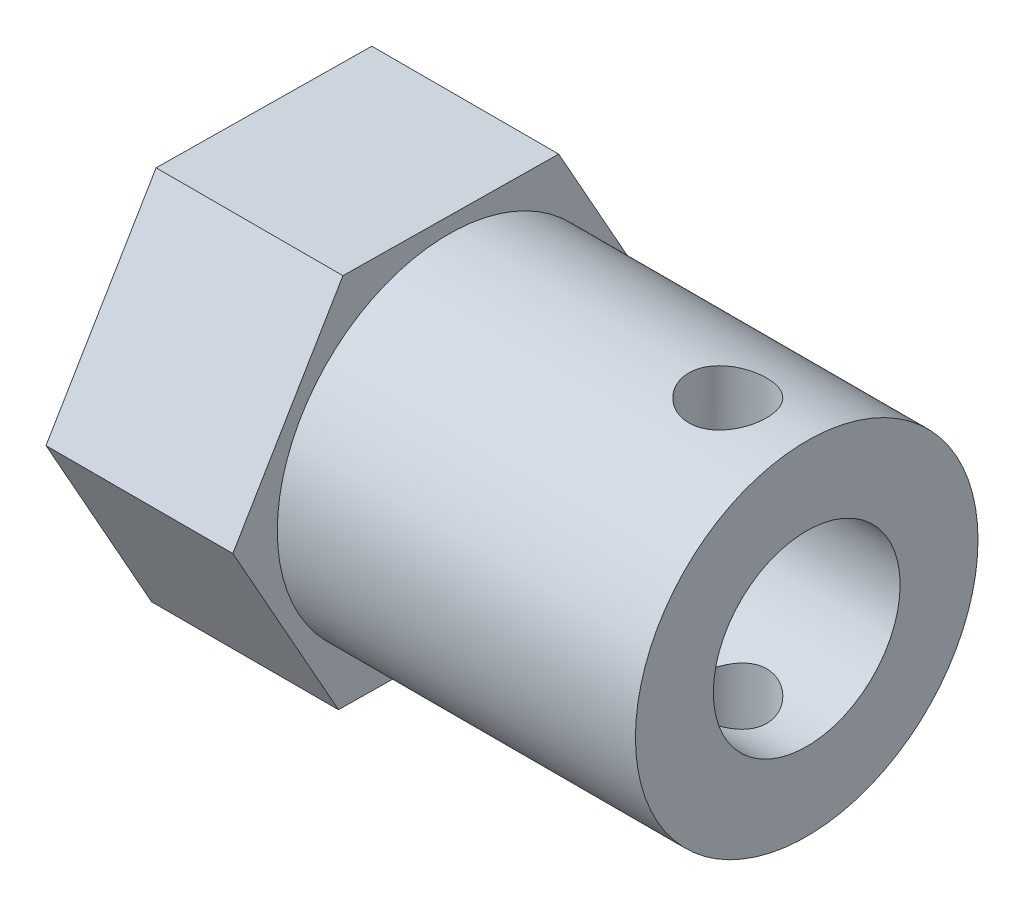
ISO-10303-21;
HEADER;
FILE_DESCRIPTION(('STEP AP214'),'2;1');
FILE_NAME('part.step','',(''),(''),'','','');
FILE_SCHEMA(('AUTOMOTIVE_DESIGN { 1 0 10303 214 1 1 1 1 }'));
ENDSEC;
DATA;
#1=APPLICATION_CONTEXT('core data for automotive mechanical design processes');
#2=APPLICATION_PROTOCOL_DEFINITION('international standard','automotive_design',2000,#1);
#3=PRODUCT_CONTEXT('',#1,'mechanical');
#4=PRODUCT('Part','Part','',(#3));
#5=PRODUCT_RELATED_PRODUCT_CATEGORY('part','',(#4));
#6=PRODUCT_DEFINITION_FORMATION('','',#4);
#7=PRODUCT_DEFINITION_CONTEXT('part definition',#1,'design');
#8=PRODUCT_DEFINITION('design','',#6,#7);
#9=PRODUCT_DEFINITION_SHAPE('','',#8);
#10=(LENGTH_UNIT() NAMED_UNIT(*) SI_UNIT(.MILLI.,.METRE.));
#11=(NAMED_UNIT(*) PLANE_ANGLE_UNIT() SI_UNIT($,.RADIAN.));
#12=(NAMED_UNIT(*) SI_UNIT($,.STERADIAN.) SOLID_ANGLE_UNIT());
#13=UNCERTAINTY_MEASURE_WITH_UNIT(LENGTH_MEASURE(1.E-05),#10,'distance_accuracy_value','');
#14=(GEOMETRIC_REPRESENTATION_CONTEXT(3) GLOBAL_UNCERTAINTY_ASSIGNED_CONTEXT((#13)) GLOBAL_UNIT_ASSIGNED_CONTEXT((#10,
#11,#12)) REPRESENTATION_CONTEXT('',''));
#15=CARTESIAN_POINT('',(0.,0.,0.));
#16=DIRECTION('',(0.,0.,1.));
#17=DIRECTION('',(1.,0.,0.));
#18=AXIS2_PLACEMENT_3D('',#15,#16,#17);
#19=CARTESIAN_POINT('',(11.5,0.,0.));
#20=DIRECTION('',(-1.,0.,0.));
#21=DIRECTION('',(0.,0.,1.));
#22=AXIS2_PLACEMENT_3D('',#19,#20,#21);
#23=CYLINDRICAL_SURFACE('',#22,5.5);
#24=CARTESIAN_POINT('',(8.96540278513979,-5.35607132140714,1.25));
#25=CARTESIAN_POINT('',(9.03463588061611,-5.35607271569806,1.24999771619423));
#26=CARTESIAN_POINT('',(9.10389582630813,-5.35742832363105,1.24422856166961));
#27=CARTESIAN_POINT('',(9.24044107266821,-5.36269332424885,1.22133260118391));
#28=CARTESIAN_POINT('',(9.3077249859071,-5.3666044684747,1.20419800533182));
#29=CARTESIAN_POINT('',(9.43832331432646,-5.3765152232523,1.15914270188604));
#30=CARTESIAN_POINT('',(9.50164218743225,-5.38251243679928,1.13123436986438));
#31=CARTESIAN_POINT('',(9.62270198498046,-5.39591668787014,1.0654598749522));
#32=CARTESIAN_POINT('',(9.68044293091887,-5.4033237199606,1.02759375043871));
#33=CARTESIAN_POINT('',(9.78976052557524,-5.41886390208649,0.942242640179427));
#34=CARTESIAN_POINT('',(9.84122067534506,-5.42700696073142,0.89461022010112));
#35=CARTESIAN_POINT('',(9.93549403769439,-5.44301514430799,0.79139673028718));
#36=CARTESIAN_POINT('',(9.97830654433696,-5.45088024650588,0.735815012255048));
#37=CARTESIAN_POINT('',(10.0545343092758,-5.465554705025,0.617495106422174));
#38=CARTESIAN_POINT('',(10.0878368853551,-5.47235100492417,0.554682564129416));
#39=CARTESIAN_POINT('',(10.1433694943463,-5.48400988207614,0.424171927818221));
#40=CARTESIAN_POINT('',(10.165600870705,-5.48887269393571,0.356474427712261));
#41=CARTESIAN_POINT('',(10.1979918330142,-5.49604666041601,0.219327796948699));
#42=CARTESIAN_POINT('',(10.2083487738185,-5.49839948403379,0.149927493751898));
#43=CARTESIAN_POINT('',(10.2173145516804,-5.50043296396436,0.0103372295205211));
#44=CARTESIAN_POINT('',(10.2159248352728,-5.50011394929908,-0.0598526332211525));
#45=CARTESIAN_POINT('',(10.2015824208531,-5.49687132737987,-0.197666935456022));
#46=CARTESIAN_POINT('',(10.1888425211329,-5.4939956555269,-0.265314815812265));
#47=CARTESIAN_POINT('',(10.1525012453141,-5.48601775047252,-0.397486515579181));
#48=CARTESIAN_POINT('',(10.1288993532431,-5.48091541149934,-0.462010186421015));
#49=CARTESIAN_POINT('',(10.0713200802062,-5.4689813591498,-0.586684721878421));
#50=CARTESIAN_POINT('',(10.0372633347719,-5.46213648824824,-0.646797621996536));
#51=CARTESIAN_POINT('',(9.95980052916184,-5.44746585730485,-0.76053199978308));
#52=CARTESIAN_POINT('',(9.9163931013488,-5.43963995384659,-0.814152526078443));
#53=CARTESIAN_POINT('',(9.82030707730814,-5.42365855332192,-0.914646772136773));
#54=CARTESIAN_POINT('',(9.76744227973959,-5.41549960097905,-0.961342074892392));
#55=CARTESIAN_POINT('',(9.65454737727108,-5.39993520224881,-1.04523960036566));
#56=CARTESIAN_POINT('',(9.59451704558225,-5.39252977972439,-1.08244152250121));
#57=CARTESIAN_POINT('',(9.46869079108492,-5.37930083956819,-1.14638443688917));
#58=CARTESIAN_POINT('',(9.4028759081799,-5.37348280157186,-1.17308932984505));
#59=CARTESIAN_POINT('',(9.26752850827014,-5.36416156133669,-1.21500479464696));
#60=CARTESIAN_POINT('',(9.19799663559214,-5.36065795929618,-1.23021735177408));
#61=CARTESIAN_POINT('',(9.05882566130886,-5.35644447103176,-1.24843460096688));
#62=CARTESIAN_POINT('',(8.98922246873293,-5.35567490508626,-1.25170012601047));
#63=CARTESIAN_POINT('',(8.85046618106715,-5.35685524946336,-1.24663886357908));
#64=CARTESIAN_POINT('',(8.781313052766,-5.35880495678504,-1.23831294143621));
#65=CARTESIAN_POINT('',(8.6463436382356,-5.36514758668855,-1.21053208830858));
#66=CARTESIAN_POINT('',(8.58049570173688,-5.36950848562745,-1.19122293373319));
#67=CARTESIAN_POINT('',(8.45296998892442,-5.38015285157009,-1.14218254768222));
#68=CARTESIAN_POINT('',(8.39129263830518,-5.38643651447105,-1.11245025421961));
#69=CARTESIAN_POINT('',(8.27273626562012,-5.40034808671371,-1.04284048047499));
#70=CARTESIAN_POINT('',(8.21595331561935,-5.4079964833553,-1.00280355444638));
#71=CARTESIAN_POINT('',(8.10981613351678,-5.42372272229399,-0.913927790878069));
#72=CARTESIAN_POINT('',(8.06046290288045,-5.43180062228642,-0.865087768698988));
#73=CARTESIAN_POINT('',(7.96956223613188,-5.44767387128745,-0.758807449059142));
#74=CARTESIAN_POINT('',(7.9281933227794,-5.45546017266619,-0.70121287661363));
#75=CARTESIAN_POINT('',(7.85571737798727,-5.46970150039047,-0.579740838143496));
#76=CARTESIAN_POINT('',(7.82460984835701,-5.47615659136063,-0.515863677334327));
#77=CARTESIAN_POINT('',(7.77378257959981,-5.48697029299492,-0.384052524657954));
#78=CARTESIAN_POINT('',(7.75398762144034,-5.49134271843123,-0.316148723135448));
#79=CARTESIAN_POINT('',(7.72611451146264,-5.49755837946589,-0.177868141541238));
#80=CARTESIAN_POINT('',(7.71803451280763,-5.49940201371996,-0.107491753059365));
#81=CARTESIAN_POINT('',(7.71390922705384,-5.50033936514418,0.032046321364278));
#82=CARTESIAN_POINT('',(7.71759824588683,-5.49949379441287,0.101199876219376));
#83=CARTESIAN_POINT('',(7.73630825947884,-5.495279008056,0.237873894864679));
#84=CARTESIAN_POINT('',(7.75132901812873,-5.49190984501223,0.305394392651152));
#85=CARTESIAN_POINT('',(7.79214460474552,-5.48303224132098,0.436661017109417));
#86=CARTESIAN_POINT('',(7.81789900769078,-5.47753183277209,0.500420291420025));
#87=CARTESIAN_POINT('',(7.8794123985696,-5.46497684589025,0.622746579339581));
#88=CARTESIAN_POINT('',(7.91517243898255,-5.4579221040757,0.68131304587022));
#89=CARTESIAN_POINT('',(7.99653376746235,-5.44284675668577,0.792878151421588));
#90=CARTESIAN_POINT('',(8.04232024234268,-5.43480943945445,0.845739490733954));
#91=CARTESIAN_POINT('',(8.14206477028438,-5.41876069975522,0.943119149893003));
#92=CARTESIAN_POINT('',(8.19602481241624,-5.41074928407657,0.987635433020155));
#93=CARTESIAN_POINT('',(8.31153878206244,-5.39552746381206,1.06769503602717));
#94=CARTESIAN_POINT('',(8.37319264162432,-5.38833055874737,1.10309689858482));
#95=CARTESIAN_POINT('',(8.5017272108256,-5.37572512012673,1.16298018793326));
#96=CARTESIAN_POINT('',(8.56860360214515,-5.3703151279975,1.18747052701551));
#97=CARTESIAN_POINT('',(8.69048676386535,-5.36285672020335,1.22064955230649));
#98=CARTESIAN_POINT('',(8.7448508714241,-5.36032965084645,1.23163414148622));
#99=CARTESIAN_POINT('',(8.85460522104708,-5.35693644077948,1.24631007168687));
#100=CARTESIAN_POINT('',(8.90999540453747,-5.35607020555341,1.25000182773419));
#101=CARTESIAN_POINT('',(8.96540278513979,-5.35607132140714,1.25));
#102=B_SPLINE_CURVE_WITH_KNOTS('',3,(#24,#25,#26,#27,#28,#29,#30,#31,#32,#33,#34,#35,#36,#37,
#38,#39,#40,#41,#42,#43,#44,#45,#46,#47,#48,#49,#50,#51,#52,#53,#54,#55,#56,#57,#58,#59,#60,#61,
#62,#63,#64,#65,#66,#67,#68,#69,#70,#71,#72,#73,#74,#75,#76,#77,#78,#79,#80,#81,#82,#83,#84,#85,
#86,#87,#88,#89,#90,#91,#92,#93,#94,#95,#96,#97,#98,#99,#100,#101),.UNSPECIFIED.,.T.,.F.,(4,2,2,
2,2,2,2,2,2,2,2,2,2,2,2,2,2,2,2,2,2,2,2,2,2,2,2,2,2,2,2,2,2,2,2,2,2,2,4),(0.,0.207496121650815,
0.41513460862239,0.622535291788398,0.829935175650532,1.04073318636022,1.2515483982898,
1.46476669375054,1.67795910969756,1.88755439091892,2.0971238620348,2.3028450333366,
2.50857597792603,2.71590898418404,2.92327233572579,3.13528932547437,3.34731302733212,
3.5600596298443,3.77276947234059,3.98080665115182,4.18882830027155,4.39415131138951,
4.59949524842834,4.8082306047921,5.01699407183283,5.2299896299062,5.44297484551386,
5.65452690065785,5.86604560147264,6.07282318924715,6.27959646870456,6.48559793754366,
6.6916210835488,6.90183008119015,7.1120903164666,7.32544005280889,7.53861520890221,
7.70468420860328,7.87074375724421),.UNSPECIFIED.);
#103=CARTESIAN_POINT('',(8.96540278513979,-5.35607132140714,1.25));
#104=VERTEX_POINT('',#103);
#105=EDGE_CURVE('E176',#104,#104,#102,.T.);
#106=ORIENTED_EDGE('',*,*,#105,.T.);
#107=EDGE_LOOP('',(#106));
#108=FACE_BOUND('',#107,.T.);
#109=CARTESIAN_POINT('',(8.96540278513979,5.35607132140714,1.25));
#110=CARTESIAN_POINT('',(8.89616968966347,5.35607271569806,1.24999771619423));
#111=CARTESIAN_POINT('',(8.82690974397145,5.35742832363105,1.24422856166961));
#112=CARTESIAN_POINT('',(8.69036449761137,5.36269332424885,1.22133260118391));
#113=CARTESIAN_POINT('',(8.62308058437248,5.3666044684747,1.20419800533182));
#114=CARTESIAN_POINT('',(8.49248225595313,5.3765152232523,1.15914270188604));
#115=CARTESIAN_POINT('',(8.42916338284733,5.38251243679928,1.13123436986438));
#116=CARTESIAN_POINT('',(8.30810358529912,5.39591668787014,1.0654598749522));
#117=CARTESIAN_POINT('',(8.25036263936071,5.4033237199606,1.02759375043871));
#118=CARTESIAN_POINT('',(8.14104504470434,5.41886390208649,0.942242640179427));
#119=CARTESIAN_POINT('',(8.08958489493452,5.42700696073142,0.894610220101119));
#120=CARTESIAN_POINT('',(7.99531153258519,5.44301514430799,0.791396730287179));
#121=CARTESIAN_POINT('',(7.95249902594262,5.45088024650588,0.735815012255048));
#122=CARTESIAN_POINT('',(7.87627126100376,5.465554705025,0.617495106422174));
#123=CARTESIAN_POINT('',(7.84296868492445,5.47235100492417,0.554682564129416));
#124=CARTESIAN_POINT('',(7.78743607593325,5.48400988207614,0.424171927818221));
#125=CARTESIAN_POINT('',(7.76520469957461,5.48887269393571,0.356474427712261));
#126=CARTESIAN_POINT('',(7.73281373726539,5.49604666041601,0.219327796948699));
#127=CARTESIAN_POINT('',(7.72245679646105,5.49839948403379,0.149927493751898));
#128=CARTESIAN_POINT('',(7.71349101859919,5.50043296396436,0.0103372295205208));
#129=CARTESIAN_POINT('',(7.71488073500683,5.50011394929908,-0.0598526332211529));
#130=CARTESIAN_POINT('',(7.72922314942653,5.49687132737987,-0.197666935456022));
#131=CARTESIAN_POINT('',(7.74196304914667,5.4939956555269,-0.265314815812265));
#132=CARTESIAN_POINT('',(7.77830432496551,5.48601775047252,-0.397486515579181));
#133=CARTESIAN_POINT('',(7.80190621703647,5.48091541149934,-0.462010186421015));
#134=CARTESIAN_POINT('',(7.85948549007335,5.4689813591498,-0.586684721878421));
#135=CARTESIAN_POINT('',(7.89354223550768,5.46213648824824,-0.646797621996536));
#136=CARTESIAN_POINT('',(7.97100504111774,5.44746585730485,-0.76053199978308));
#137=CARTESIAN_POINT('',(8.01441246893078,5.43963995384659,-0.814152526078443));
#138=CARTESIAN_POINT('',(8.11049849297144,5.42365855332192,-0.914646772136773));
#139=CARTESIAN_POINT('',(8.16336329053999,5.41549960097905,-0.961342074892392));
#140=CARTESIAN_POINT('',(8.2762581930085,5.39993520224881,-1.04523960036566));
#141=CARTESIAN_POINT('',(8.33628852469733,5.39252977972439,-1.08244152250121));
#142=CARTESIAN_POINT('',(8.46211477919466,5.37930083956819,-1.14638443688917));
#143=CARTESIAN_POINT('',(8.52792966209968,5.37348280157186,-1.17308932984505));
#144=CARTESIAN_POINT('',(8.66327706200945,5.36416156133669,-1.21500479464696));
#145=CARTESIAN_POINT('',(8.73280893468744,5.36065795929618,-1.23021735177408));
#146=CARTESIAN_POINT('',(8.87197990897072,5.35644447103176,-1.24843460096688));
#147=CARTESIAN_POINT('',(8.94158310154665,5.35567490508626,-1.25170012601047));
#148=CARTESIAN_POINT('',(9.08033938921243,5.35685524946336,-1.24663886357908));
#149=CARTESIAN_POINT('',(9.14949251751359,5.35880495678504,-1.23831294143621));
#150=CARTESIAN_POINT('',(9.28446193204398,5.36514758668855,-1.21053208830858));
#151=CARTESIAN_POINT('',(9.3503098685427,5.36950848562745,-1.19122293373319));
#152=CARTESIAN_POINT('',(9.47783558135516,5.38015285157009,-1.14218254768222));
#153=CARTESIAN_POINT('',(9.5395129319744,5.38643651447105,-1.11245025421961));
#154=CARTESIAN_POINT('',(9.65806930465946,5.40034808671371,-1.04284048047499));
#155=CARTESIAN_POINT('',(9.71485225466023,5.4079964833553,-1.00280355444638));
#156=CARTESIAN_POINT('',(9.8209894367628,5.42372272229399,-0.913927790878069));
#157=CARTESIAN_POINT('',(9.87034266739913,5.43180062228642,-0.865087768698988));
#158=CARTESIAN_POINT('',(9.9612433341477,5.44767387128745,-0.758807449059142));
#159=CARTESIAN_POINT('',(10.0026122475002,5.45546017266619,-0.701212876613629));
#160=CARTESIAN_POINT('',(10.0750881922923,5.46970150039047,-0.579740838143496));
#161=CARTESIAN_POINT('',(10.1061957219226,5.47615659136063,-0.515863677334327));
#162=CARTESIAN_POINT('',(10.1570229906798,5.48697029299492,-0.384052524657955));
#163=CARTESIAN_POINT('',(10.1768179488392,5.49134271843123,-0.316148723135449));
#164=CARTESIAN_POINT('',(10.2046910588169,5.49755837946589,-0.177868141541239));
#165=CARTESIAN_POINT('',(10.2127710574719,5.49940201371996,-0.107491753059365));
#166=CARTESIAN_POINT('',(10.2168963432257,5.50033936514418,0.0320463213642781));
#167=CARTESIAN_POINT('',(10.2132073243928,5.49949379441287,0.101199876219376));
#168=CARTESIAN_POINT('',(10.1944973108007,5.495279008056,0.237873894864679));
#169=CARTESIAN_POINT('',(10.1794765521508,5.49190984501223,0.305394392651152));
#170=CARTESIAN_POINT('',(10.1386609655341,5.48303224132098,0.436661017109417));
#171=CARTESIAN_POINT('',(10.1129065625888,5.47753183277209,0.500420291420025));
#172=CARTESIAN_POINT('',(10.05139317171,5.46497684589025,0.622746579339581));
#173=CARTESIAN_POINT('',(10.015633131297,5.4579221040757,0.68131304587022));
#174=CARTESIAN_POINT('',(9.93427180281723,5.44284675668577,0.792878151421588));
#175=CARTESIAN_POINT('',(9.8884853279369,5.43480943945445,0.845739490733953));
#176=CARTESIAN_POINT('',(9.7887407999952,5.41876069975522,0.943119149893002));
#177=CARTESIAN_POINT('',(9.73478075786334,5.41074928407657,0.987635433020155));
#178=CARTESIAN_POINT('',(9.61926678821714,5.39552746381206,1.06769503602717));
#179=CARTESIAN_POINT('',(9.55761292865526,5.38833055874737,1.10309689858482));
#180=CARTESIAN_POINT('',(9.42907835945398,5.37572512012673,1.16298018793326));
#181=CARTESIAN_POINT('',(9.36220196813443,5.3703151279975,1.18747052701551));
#182=CARTESIAN_POINT('',(9.24031880641423,5.36285672020335,1.22064955230649));
#183=CARTESIAN_POINT('',(9.18595469885549,5.36032965084645,1.23163414148622));
#184=CARTESIAN_POINT('',(9.07620034923251,5.35693644077948,1.24631007168687));
#185=CARTESIAN_POINT('',(9.02081016574211,5.35607020555341,1.25000182773419));
#186=CARTESIAN_POINT('',(8.96540278513979,5.35607132140714,1.25));
#187=B_SPLINE_CURVE_WITH_KNOTS('',3,(#109,#110,#111,#112,#113,#114,#115,#116,#117,#118,#119,
#120,#121,#122,#123,#124,#125,#126,#127,#128,#129,#130,#131,#132,#133,#134,#135,#136,#137,#138,
#139,#140,#141,#142,#143,#144,#145,#146,#147,#148,#149,#150,#151,#152,#153,#154,#155,#156,#157,
#158,#159,#160,#161,#162,#163,#164,#165,#166,#167,#168,#169,#170,#171,#172,#173,#174,#175,#176,
#177,#178,#179,#180,#181,#182,#183,#184,#185,#186),.UNSPECIFIED.,.T.,.F.,(4,2,2,2,2,2,2,2,2,2,2,
2,2,2,2,2,2,2,2,2,2,2,2,2,2,2,2,2,2,2,2,2,2,2,2,2,2,2,4),(0.,0.207496121650815,0.41513460862239,
0.6225352917884,0.829935175650532,1.04073318636022,1.2515483982898,1.46476669375054,
1.67795910969756,1.88755439091892,2.0971238620348,2.3028450333366,2.50857597792603,
2.71590898418404,2.92327233572579,3.13528932547437,3.34731302733212,3.5600596298443,
3.77276947234059,3.98080665115182,4.18882830027155,4.39415131138951,4.59949524842834,
4.8082306047921,5.01699407183283,5.2299896299062,5.44297484551386,5.65452690065785,
5.86604560147264,6.07282318924714,6.27959646870456,6.48559793754366,6.6916210835488,
6.90183008119014,7.11209031646659,7.32544005280888,7.5386152089022,7.70468420860328,
7.87074375724421),.UNSPECIFIED.);
#188=CARTESIAN_POINT('',(8.96540278513979,5.35607132140714,1.25));
#189=VERTEX_POINT('',#188);
#190=EDGE_CURVE('E170',#189,#189,#187,.T.);
#191=ORIENTED_EDGE('',*,*,#190,.T.);
#192=EDGE_LOOP('',(#191));
#193=FACE_BOUND('',#192,.T.);
#194=CARTESIAN_POINT('',(11.5,0.,0.));
#195=DIRECTION('',(1.,0.,0.));
#196=DIRECTION('',(0.,0.,-1.));
#197=AXIS2_PLACEMENT_3D('',#194,#195,#196);
#198=CIRCLE('',#197,5.5);
#199=CARTESIAN_POINT('',(11.5,0.,-5.5));
#200=VERTEX_POINT('',#199);
#201=EDGE_CURVE('E11',#200,#200,#198,.T.);
#202=ORIENTED_EDGE('',*,*,#201,.F.);
#203=EDGE_LOOP('',(#202));
#204=FACE_BOUND('',#203,.T.);
#205=CARTESIAN_POINT('',(0.,0.,0.));
#206=DIRECTION('',(1.,0.,0.));
#207=DIRECTION('',(0.,0.,-1.));
#208=AXIS2_PLACEMENT_3D('',#205,#206,#207);
#209=CIRCLE('',#208,5.5);
#210=CARTESIAN_POINT('',(0.,0.,-5.5));
#211=VERTEX_POINT('',#210);
#212=EDGE_CURVE('E47',#211,#211,#209,.T.);
#213=ORIENTED_EDGE('',*,*,#212,.T.);
#214=EDGE_LOOP('',(#213));
#215=FACE_BOUND('',#214,.T.);
#216=ADVANCED_FACE('F32',(#108,#193,#204,#215),#23,.T.);
#217=CARTESIAN_POINT('',(11.5,0.,0.));
#218=DIRECTION('',(1.,0.,0.));
#219=DIRECTION('',(0.,0.,-1.));
#220=AXIS2_PLACEMENT_3D('',#217,#218,#219);
#221=PLANE('',#220);
#222=CARTESIAN_POINT('',(11.5,0.,0.));
#223=DIRECTION('',(1.,0.,0.));
#224=DIRECTION('',(0.,0.,-1.));
#225=AXIS2_PLACEMENT_3D('',#222,#223,#224);
#226=CIRCLE('',#225,3.);
#227=CARTESIAN_POINT('',(11.5,0.,-3.));
#228=VERTEX_POINT('',#227);
#229=EDGE_CURVE('E184',#228,#228,#226,.T.);
#230=ORIENTED_EDGE('',*,*,#229,.F.);
#231=EDGE_LOOP('',(#230));
#232=FACE_BOUND('',#231,.T.);
#233=ORIENTED_EDGE('',*,*,#201,.T.);
#234=EDGE_LOOP('',(#233));
#235=FACE_BOUND('',#234,.T.);
#236=ADVANCED_FACE('F212',(#232,#235),#221,.T.);
#237=CARTESIAN_POINT('',(-6.,0.0826139418940273,6.9277106562417));
#238=DIRECTION('',(0.,-0.510291194267876,-0.860001684331295));
#239=DIRECTION('',(0.,0.860001684331295,-0.510291194267876));
#240=AXIS2_PLACEMENT_3D('',#237,#238,#239);
#241=PLANE('',#240);
#242=DIRECTION('',(0.,0.860001684331295,-0.510291194267876));
#243=VECTOR('',#242,1.);
#244=CARTESIAN_POINT('',(0.,0.0826139418940273,6.9277106562417));
#245=LINE('',#244,#243);
#246=CARTESIAN_POINT('',(0.,0.0826139418940273,6.9277106562417));
#247=VERTEX_POINT('',#246);
#248=CARTESIAN_POINT('',(0.,6.04088038932049,3.39230955573385));
#249=VERTEX_POINT('',#248);
#250=EDGE_CURVE('E125',#247,#249,#245,.T.);
#251=ORIENTED_EDGE('',*,*,#250,.T.);
#252=DIRECTION('',(1.,0.,0.));
#253=VECTOR('',#252,1.);
#254=CARTESIAN_POINT('',(-6.,6.04088038932049,3.39230955573385));
#255=LINE('',#254,#253);
#256=CARTESIAN_POINT('',(-6.,6.04088038932049,3.39230955573385));
#257=VERTEX_POINT('',#256);
#258=EDGE_CURVE('E143',#257,#249,#255,.T.);
#259=ORIENTED_EDGE('',*,*,#258,.F.);
#260=DIRECTION('',(0.,0.860001684331295,-0.510291194267876));
#261=VECTOR('',#260,1.);
#262=CARTESIAN_POINT('',(-6.,0.0826139418940273,6.9277106562417));
#263=LINE('',#262,#261);
#264=CARTESIAN_POINT('',(-6.,0.0826139418940273,6.9277106562417));
#265=VERTEX_POINT('',#264);
#266=EDGE_CURVE('E136',#265,#257,#263,.T.);
#267=ORIENTED_EDGE('',*,*,#266,.F.);
#268=DIRECTION('',(1.,0.,0.));
#269=VECTOR('',#268,1.);
#270=CARTESIAN_POINT('',(-6.,0.0826139418940273,6.9277106562417));
#271=LINE('',#270,#269);
#272=EDGE_CURVE('E121',#265,#247,#271,.T.);
#273=ORIENTED_EDGE('',*,*,#272,.T.);
#274=EDGE_LOOP('',(#251,#259,#267,#273));
#275=FACE_BOUND('',#274,.T.);
#276=ADVANCED_FACE('F200',(#275),#241,.F.);
#277=CARTESIAN_POINT('',(-6.,6.04088038932049,3.39230955573385));
#278=DIRECTION('',(0.,-0.999928903062245,0.0119242953978331));
#279=DIRECTION('',(0.,-0.0119242953978331,-0.999928903062245));
#280=AXIS2_PLACEMENT_3D('',#277,#278,#279);
#281=PLANE('',#280);
#282=DIRECTION('',(0.,-0.0119242953978331,-0.999928903062245));
#283=VECTOR('',#282,1.);
#284=CARTESIAN_POINT('',(0.,6.04088038932049,3.39230955573385));
#285=LINE('',#284,#283);
#286=CARTESIAN_POINT('',(0.,5.95826644742646,-3.53540110050785));
#287=VERTEX_POINT('',#286);
#288=EDGE_CURVE('E128',#249,#287,#285,.T.);
#289=ORIENTED_EDGE('',*,*,#288,.T.);
#290=DIRECTION('',(1.,0.,0.));
#291=VECTOR('',#290,1.);
#292=CARTESIAN_POINT('',(-6.,5.95826644742646,-3.53540110050785));
#293=LINE('',#292,#291);
#294=CARTESIAN_POINT('',(-6.,5.95826644742646,-3.53540110050785));
#295=VERTEX_POINT('',#294);
#296=EDGE_CURVE('E140',#295,#287,#293,.T.);
#297=ORIENTED_EDGE('',*,*,#296,.F.);
#298=DIRECTION('',(0.,-0.0119242953978331,-0.999928903062245));
#299=VECTOR('',#298,1.);
#300=CARTESIAN_POINT('',(-6.,6.04088038932049,3.39230955573385));
#301=LINE('',#300,#299);
#302=EDGE_CURVE('E94',#257,#295,#301,.T.);
#303=ORIENTED_EDGE('',*,*,#302,.F.);
#304=ORIENTED_EDGE('',*,*,#258,.T.);
#305=EDGE_LOOP('',(#289,#297,#303,#304));
#306=FACE_BOUND('',#305,.T.);
#307=ADVANCED_FACE('F192',(#306),#281,.F.);
#308=CARTESIAN_POINT('',(-6.,5.95826644742646,-3.53540110050785));
#309=DIRECTION('',(0.,-0.489637708794369,0.871925979729128));
#310=DIRECTION('',(0.,-0.871925979729129,-0.489637708794369));
#311=AXIS2_PLACEMENT_3D('',#308,#309,#310);
#312=PLANE('',#311);
#313=DIRECTION('',(0.,-0.871925979729128,-0.489637708794369));
#314=VECTOR('',#313,1.);
#315=CARTESIAN_POINT('',(0.,5.95826644742646,-3.53540110050785));
#316=LINE('',#315,#314);
#317=CARTESIAN_POINT('',(0.,-0.0826139418940285,-6.9277106562417));
#318=VERTEX_POINT('',#317);
#319=EDGE_CURVE('E131',#287,#318,#316,.T.);
#320=ORIENTED_EDGE('',*,*,#319,.T.);
#321=DIRECTION('',(1.,0.,0.));
#322=VECTOR('',#321,1.);
#323=CARTESIAN_POINT('',(-6.,-0.0826139418940285,-6.9277106562417));
#324=LINE('',#323,#322);
#325=CARTESIAN_POINT('',(-6.,-0.0826139418940285,-6.9277106562417));
#326=VERTEX_POINT('',#325);
#327=EDGE_CURVE('E116',#326,#318,#324,.T.);
#328=ORIENTED_EDGE('',*,*,#327,.F.);
#329=DIRECTION('',(0.,-0.871925979729128,-0.489637708794369));
#330=VECTOR('',#329,1.);
#331=CARTESIAN_POINT('',(-6.,5.95826644742646,-3.53540110050785));
#332=LINE('',#331,#330);
#333=EDGE_CURVE('E107',#295,#326,#332,.T.);
#334=ORIENTED_EDGE('',*,*,#333,.F.);
#335=ORIENTED_EDGE('',*,*,#296,.T.);
#336=EDGE_LOOP('',(#320,#328,#334,#335));
#337=FACE_BOUND('',#336,.T.);
#338=ADVANCED_FACE('F195',(#337),#312,.F.);
#339=CARTESIAN_POINT('',(-6.,-0.0826139418940285,-6.9277106562417));
#340=DIRECTION('',(0.,0.510291194267876,0.860001684331295));
#341=DIRECTION('',(0.,-0.860001684331295,0.510291194267876));
#342=AXIS2_PLACEMENT_3D('',#339,#340,#341);
#343=PLANE('',#342);
#344=DIRECTION('',(0.,-0.860001684331295,0.510291194267876));
#345=VECTOR('',#344,1.);
#346=CARTESIAN_POINT('',(0.,-0.0826139418940285,-6.9277106562417));
#347=LINE('',#346,#345);
#348=CARTESIAN_POINT('',(0.,-6.04088038932049,-3.39230955573385));
#349=VERTEX_POINT('',#348);
#350=EDGE_CURVE('E115',#318,#349,#347,.T.);
#351=ORIENTED_EDGE('',*,*,#350,.T.);
#352=DIRECTION('',(1.,0.,0.));
#353=VECTOR('',#352,1.);
#354=CARTESIAN_POINT('',(-6.,-6.04088038932049,-3.39230955573385));
#355=LINE('',#354,#353);
#356=CARTESIAN_POINT('',(-6.,-6.04088038932049,-3.39230955573385));
#357=VERTEX_POINT('',#356);
#358=EDGE_CURVE('E112',#357,#349,#355,.T.);
#359=ORIENTED_EDGE('',*,*,#358,.F.);
#360=DIRECTION('',(0.,-0.860001684331295,0.510291194267876));
#361=VECTOR('',#360,1.);
#362=CARTESIAN_POINT('',(-6.,-0.0826139418940285,-6.9277106562417));
#363=LINE('',#362,#361);
#364=EDGE_CURVE('E101',#326,#357,#363,.T.);
#365=ORIENTED_EDGE('',*,*,#364,.F.);
#366=ORIENTED_EDGE('',*,*,#327,.T.);
#367=EDGE_LOOP('',(#351,#359,#365,#366));
#368=FACE_BOUND('',#367,.T.);
#369=ADVANCED_FACE('F113',(#368),#343,.F.);
#370=CARTESIAN_POINT('',(-6.,-6.04088038932049,-3.39230955573385));
#371=DIRECTION('',(0.,0.999928903062245,-0.0119242953978332));
#372=DIRECTION('',(0.,0.0119242953978332,0.999928903062245));
#373=AXIS2_PLACEMENT_3D('',#370,#371,#372);
#374=PLANE('',#373);
#375=DIRECTION('',(0.,0.0119242953978332,0.999928903062245));
#376=VECTOR('',#375,1.);
#377=CARTESIAN_POINT('',(0.,-6.04088038932049,-3.39230955573385));
#378=LINE('',#377,#376);
#379=CARTESIAN_POINT('',(0.,-5.95826644742646,3.53540110050785));
#380=VERTEX_POINT('',#379);
#381=EDGE_CURVE('E79',#349,#380,#378,.T.);
#382=ORIENTED_EDGE('',*,*,#381,.T.);
#383=DIRECTION('',(1.,0.,0.));
#384=VECTOR('',#383,1.);
#385=CARTESIAN_POINT('',(-6.,-5.95826644742646,3.53540110050785));
#386=LINE('',#385,#384);
#387=CARTESIAN_POINT('',(-6.,-5.95826644742646,3.53540110050785));
#388=VERTEX_POINT('',#387);
#389=EDGE_CURVE('E117',#388,#380,#386,.T.);
#390=ORIENTED_EDGE('',*,*,#389,.F.);
#391=DIRECTION('',(0.,0.0119242953978332,0.999928903062245));
#392=VECTOR('',#391,1.);
#393=CARTESIAN_POINT('',(-6.,-6.04088038932049,-3.39230955573385));
#394=LINE('',#393,#392);
#395=EDGE_CURVE('E105',#357,#388,#394,.T.);
#396=ORIENTED_EDGE('',*,*,#395,.F.);
#397=ORIENTED_EDGE('',*,*,#358,.T.);
#398=EDGE_LOOP('',(#382,#390,#396,#397));
#399=FACE_BOUND('',#398,.T.);
#400=ADVANCED_FACE('F119',(#399),#374,.F.);
#401=CARTESIAN_POINT('',(-6.,-5.95826644742646,3.53540110050785));
#402=DIRECTION('',(0.,0.489637708794369,-0.871925979729128));
#403=DIRECTION('',(0.,0.871925979729128,0.489637708794369));
#404=AXIS2_PLACEMENT_3D('',#401,#402,#403);
#405=PLANE('',#404);
#406=DIRECTION('',(0.,0.871925979729128,0.489637708794369));
#407=VECTOR('',#406,1.);
#408=CARTESIAN_POINT('',(0.,-5.95826644742646,3.53540110050785));
#409=LINE('',#408,#407);
#410=EDGE_CURVE('E85',#380,#247,#409,.T.);
#411=ORIENTED_EDGE('',*,*,#410,.T.);
#412=ORIENTED_EDGE('',*,*,#272,.F.);
#413=DIRECTION('',(0.,0.871925979729128,0.489637708794369));
#414=VECTOR('',#413,1.);
#415=CARTESIAN_POINT('',(-6.,-5.95826644742646,3.53540110050785));
#416=LINE('',#415,#414);
#417=EDGE_CURVE('E56',#388,#265,#416,.T.);
#418=ORIENTED_EDGE('',*,*,#417,.F.);
#419=ORIENTED_EDGE('',*,*,#389,.T.);
#420=EDGE_LOOP('',(#411,#412,#418,#419));
#421=FACE_BOUND('',#420,.T.);
#422=ADVANCED_FACE('F201',(#421),#405,.F.);
#423=CARTESIAN_POINT('',(-6.,0.,0.));
#424=DIRECTION('',(-1.,0.,0.));
#425=DIRECTION('',(0.,0.,1.));
#426=AXIS2_PLACEMENT_3D('',#423,#424,#425);
#427=PLANE('',#426);
#428=CARTESIAN_POINT('',(-6.,0.,0.));
#429=DIRECTION('',(-1.,0.,0.));
#430=DIRECTION('',(0.,0.,1.));
#431=AXIS2_PLACEMENT_3D('',#428,#429,#430);
#432=CIRCLE('',#431,1.5);
#433=CARTESIAN_POINT('',(-6.,0.,1.5));
#434=VERTEX_POINT('',#433);
#435=EDGE_CURVE('E177',#434,#434,#432,.T.);
#436=ORIENTED_EDGE('',*,*,#435,.F.);
#437=EDGE_LOOP('',(#436));
#438=FACE_BOUND('',#437,.T.);
#439=ORIENTED_EDGE('',*,*,#266,.T.);
#440=ORIENTED_EDGE('',*,*,#302,.T.);
#441=ORIENTED_EDGE('',*,*,#333,.T.);
#442=ORIENTED_EDGE('',*,*,#364,.T.);
#443=ORIENTED_EDGE('',*,*,#395,.T.);
#444=ORIENTED_EDGE('',*,*,#417,.T.);
#445=EDGE_LOOP('',(#439,#440,#441,#442,#443,#444));
#446=FACE_BOUND('',#445,.T.);
#447=ADVANCED_FACE('F103',(#438,#446),#427,.T.);
#448=CARTESIAN_POINT('',(0.,0.,0.));
#449=DIRECTION('',(-1.,0.,0.));
#450=DIRECTION('',(0.,0.,1.));
#451=AXIS2_PLACEMENT_3D('',#448,#449,#450);
#452=PLANE('',#451);
#453=ORIENTED_EDGE('',*,*,#212,.F.);
#454=EDGE_LOOP('',(#453));
#455=FACE_BOUND('',#454,.T.);
#456=ORIENTED_EDGE('',*,*,#250,.F.);
#457=ORIENTED_EDGE('',*,*,#410,.F.);
#458=ORIENTED_EDGE('',*,*,#381,.F.);
#459=ORIENTED_EDGE('',*,*,#350,.F.);
#460=ORIENTED_EDGE('',*,*,#319,.F.);
#461=ORIENTED_EDGE('',*,*,#288,.F.);
#462=EDGE_LOOP('',(#456,#457,#458,#459,#460,#461));
#463=FACE_BOUND('',#462,.T.);
#464=ADVANCED_FACE('F198',(#455,#463),#452,.F.);
#465=CARTESIAN_POINT('',(1.5,0.,0.));
#466=DIRECTION('',(1.,0.,0.));
#467=DIRECTION('',(0.,0.,-1.));
#468=AXIS2_PLACEMENT_3D('',#465,#466,#467);
#469=CYLINDRICAL_SURFACE('',#468,3.);
#470=CARTESIAN_POINT('',(8.96540278513979,-2.72717802865893,1.25));
#471=CARTESIAN_POINT('',(8.89873089424294,-2.72718519563219,1.24999259066567));
#472=CARTESIAN_POINT('',(8.83195012831358,-2.729658595344,1.24463203881503));
#473=CARTESIAN_POINT('',(8.70031584308265,-2.73923833650884,1.22339678947785));
#474=CARTESIAN_POINT('',(8.63546805846456,-2.74635725824267,1.20749354003276));
#475=CARTESIAN_POINT('',(8.50984165544872,-2.76426917574768,1.16589988419451));
#476=CARTESIAN_POINT('',(8.44904762142477,-2.77504717562616,1.14024937431428));
#477=CARTESIAN_POINT('',(8.33264333556174,-2.79904148565793,1.08000637754463));
#478=CARTESIAN_POINT('',(8.27703186170667,-2.81225721880783,1.04541600591531));
#479=CARTESIAN_POINT('',(8.16907706016632,-2.84055762619857,0.965973882676167));
#480=CARTESIAN_POINT('',(8.1170952263957,-2.85570568079146,0.920653238184409));
#481=CARTESIAN_POINT('',(8.02120256264223,-2.88564295372227,0.82202167574555));
#482=CARTESIAN_POINT('',(7.97729484452678,-2.90043203180789,0.768707691374005));
#483=CARTESIAN_POINT('',(7.89695325426051,-2.92875537930613,0.652763393797348));
#484=CARTESIAN_POINT('',(7.86092615710744,-2.94220739975291,0.589829293683659));
#485=CARTESIAN_POINT('',(7.80012676463419,-2.96556519993426,0.458132022362353));
#486=CARTESIAN_POINT('',(7.77534947317557,-2.97547255347157,0.389371454872125));
#487=CARTESIAN_POINT('',(7.73906332638305,-2.99017521042367,0.251768498025166));
#488=CARTESIAN_POINT('',(7.72693109023774,-2.99520971127466,0.183116576196081));
#489=CARTESIAN_POINT('',(7.71426514397993,-3.00046828611204,0.0445791803650066));
#490=CARTESIAN_POINT('',(7.71372672925683,-3.00069431131015,-0.0253057817645158));
#491=CARTESIAN_POINT('',(7.72393706607311,-2.99645129133057,-0.159792780112567));
#492=CARTESIAN_POINT('',(7.73400088566552,-2.99226714648664,-0.224457488607313));
#493=CARTESIAN_POINT('',(7.76395588777795,-2.98006516750309,-0.351082893931455));
#494=CARTESIAN_POINT('',(7.78384779476996,-2.97204705074577,-0.413043391054915));
#495=CARTESIAN_POINT('',(7.83313082603443,-2.95279852414029,-0.533638118077525));
#496=CARTESIAN_POINT('',(7.86266224801061,-2.94152097126085,-0.592207177074905));
#497=CARTESIAN_POINT('',(7.93024854184013,-2.91685713989805,-0.703711767281963));
#498=CARTESIAN_POINT('',(7.96830642598477,-2.90347011666255,-0.756645297756974));
#499=CARTESIAN_POINT('',(8.05498520554441,-2.87481698777061,-0.859340911707923));
#500=CARTESIAN_POINT('',(8.1041615764188,-2.8594849435601,-0.908616437316239));
#501=CARTESIAN_POINT('',(8.21011422584637,-2.8293786068147,-0.998431414927666));
#502=CARTESIAN_POINT('',(8.26689342343188,-2.8146045313137,-1.03896749582431));
#503=CARTESIAN_POINT('',(8.3887978218017,-2.78681612355338,-1.11140189250063));
#504=CARTESIAN_POINT('',(8.45413599088307,-2.77387558556714,-1.1429725335554));
#505=CARTESIAN_POINT('',(8.58988383011429,-2.75209844221011,-1.19446432058392));
#506=CARTESIAN_POINT('',(8.66028983340934,-2.74325890334594,-1.21439379627313));
#507=CARTESIAN_POINT('',(8.79929959405379,-2.73141212519724,-1.24080025168121));
#508=CARTESIAN_POINT('',(8.86772390739884,-2.72806369197117,-1.24806614632866));
#509=CARTESIAN_POINT('',(9.00488126755129,-2.72660286810642,-1.25125630518999));
#510=CARTESIAN_POINT('',(9.0736141993315,-2.72848866599319,-1.24718449318149));
#511=CARTESIAN_POINT('',(9.20480117057024,-2.73693131345749,-1.22853477565556));
#512=CARTESIAN_POINT('',(9.26737547192659,-2.74318138016618,-1.21464618818048));
#513=CARTESIAN_POINT('',(9.38925408163766,-2.75925630297447,-1.17767058564225));
#514=CARTESIAN_POINT('',(9.4485576219705,-2.76908199460161,-1.15458142053125));
#515=CARTESIAN_POINT('',(9.56501809549626,-2.79170797857,-1.09877520805187));
#516=CARTESIAN_POINT('',(9.62197775975011,-2.80461662202282,-1.06569183306198));
#517=CARTESIAN_POINT('',(9.72981083763881,-2.83180003740794,-0.991200784385972));
#518=CARTESIAN_POINT('',(9.78068160184166,-2.84607539920583,-0.949789507875989));
#519=CARTESIAN_POINT('',(9.8792029200238,-2.87578619784532,-0.855844455715506));
#520=CARTESIAN_POINT('',(9.92625418509045,-2.89122146708842,-0.802679661479739));
#521=CARTESIAN_POINT('',(10.0108750771191,-2.92043361183923,-0.688851512553539));
#522=CARTESIAN_POINT('',(10.0484440092035,-2.93421036577013,-0.628187608803656));
#523=CARTESIAN_POINT('',(10.1129926605834,-2.9586425158565,-0.500654680803385));
#524=CARTESIAN_POINT('',(10.1399450264293,-2.96928983138826,-0.433770169638507));
#525=CARTESIAN_POINT('',(10.1820195774742,-2.98618173103366,-0.295858835154418));
#526=CARTESIAN_POINT('',(10.1971488033659,-2.9924289351992,-0.224834504225196));
#527=CARTESIAN_POINT('',(10.2142609106601,-2.9995153479751,-0.086016533506412));
#528=CARTESIAN_POINT('',(10.2170887848368,-3.00070204534225,-0.0183440847938987));
#529=CARTESIAN_POINT('',(10.2117896438459,-2.99849523480953,0.116486811714284));
#530=CARTESIAN_POINT('',(10.2036645491269,-2.99510252984313,0.183645347541154));
#531=CARTESIAN_POINT('',(10.1772967129811,-2.98430065981734,0.313086482449184));
#532=CARTESIAN_POINT('',(10.1594231046702,-2.97703824209233,0.375457537843568));
#533=CARTESIAN_POINT('',(10.1144685379307,-2.95929499847058,0.49629223050133));
#534=CARTESIAN_POINT('',(10.0873858304749,-2.94881356124207,0.554755122985826));
#535=CARTESIAN_POINT('',(10.0234132559253,-2.92505825398662,0.669024565478781));
#536=CARTESIAN_POINT('',(9.9861354837158,-2.91167959188766,0.724591657976681));
#537=CARTESIAN_POINT('',(9.9033956022679,-2.88371561874231,0.828918675638781));
#538=CARTESIAN_POINT('',(9.85793045473304,-2.86912986083797,0.877676061786042));
#539=CARTESIAN_POINT('',(9.75645795928539,-2.83914845259141,0.97044978723158));
#540=CARTESIAN_POINT('',(9.69994377051867,-2.82376522857896,1.01391775364847));
#541=CARTESIAN_POINT('',(9.5799440444596,-2.79495552690186,1.09083332306674));
#542=CARTESIAN_POINT('',(9.51645463708165,-2.78153014522558,1.12427532456755));
#543=CARTESIAN_POINT('',(9.38445895011704,-2.75842557732642,1.17982766043577));
#544=CARTESIAN_POINT('',(9.31598162634658,-2.74872654469865,1.20199823632854));
#545=CARTESIAN_POINT('',(9.17586321128912,-2.73440803066667,1.23423556453801));
#546=CARTESIAN_POINT('',(9.10423357786549,-2.72977151604981,1.2443429152121));
#547=CARTESIAN_POINT('',(9.0100442608779,-2.72744979732688,1.2494046492365));
#548=CARTESIAN_POINT('',(8.98772962775175,-2.72717562860874,1.25000248121118));
#549=CARTESIAN_POINT('',(8.96540278513979,-2.72717802865893,1.25));
#550=B_SPLINE_CURVE_WITH_KNOTS('',3,(#470,#471,#472,#473,#474,#475,#476,#477,#478,#479,#480,
#481,#482,#483,#484,#485,#486,#487,#488,#489,#490,#491,#492,#493,#494,#495,#496,#497,#498,#499,
#500,#501,#502,#503,#504,#505,#506,#507,#508,#509,#510,#511,#512,#513,#514,#515,#516,#517,#518,
#519,#520,#521,#522,#523,#524,#525,#526,#527,#528,#529,#530,#531,#532,#533,#534,#535,#536,#537,
#538,#539,#540,#541,#542,#543,#544,#545,#546,#547,#548,#549),.UNSPECIFIED.,.T.,.F.,(4,2,2,2,2,2,
2,2,2,2,2,2,2,2,2,2,2,2,2,2,2,2,2,2,2,2,2,2,2,2,2,2,2,2,2,2,2,2,2,4),(0.,0.199951711985515,
0.400447161842176,0.600130652152113,0.799766938550099,1.01066841430654,1.22165100459911,
1.44178476577924,1.66182066774891,1.87040605977952,2.0789068091793,2.27471840245093,
2.47054443201884,2.66935814640065,2.86824221022484,3.08114531844484,3.29413040441366,
3.51411545666722,3.73394290745569,3.93950778306307,4.14500152518448,4.33733901066192,
4.5297214691353,4.73025126818169,4.93086800795465,5.14781662735514,5.36478114041866,
5.58230105955595,5.79969134643007,6.00188635094053,6.20404590801914,6.39903415036488,
6.59405944632173,6.79789862829037,7.00181361048904,7.21960426908077,7.43751638139189,
7.65425125796865,7.87025464546163,7.93721375436706),.UNSPECIFIED.);
#551=CARTESIAN_POINT('',(8.96540278513979,-2.72717802865893,1.25));
#552=VERTEX_POINT('',#551);
#553=EDGE_CURVE('E36',#552,#552,#550,.T.);
#554=ORIENTED_EDGE('',*,*,#553,.T.);
#555=EDGE_LOOP('',(#554));
#556=FACE_BOUND('',#555,.T.);
#557=CARTESIAN_POINT('',(8.96540278513979,2.72717802865893,1.25));
#558=CARTESIAN_POINT('',(9.03207467603665,2.72718519563219,1.24999259066567));
#559=CARTESIAN_POINT('',(9.09885544196601,2.729658595344,1.24463203881503));
#560=CARTESIAN_POINT('',(9.23048972719693,2.73923833650884,1.22339678947785));
#561=CARTESIAN_POINT('',(9.29533751181503,2.74635725824267,1.20749354003276));
#562=CARTESIAN_POINT('',(9.42096391483086,2.76426917574768,1.16589988419451));
#563=CARTESIAN_POINT('',(9.48175794885481,2.77504717562616,1.14024937431428));
#564=CARTESIAN_POINT('',(9.59816223471784,2.79904148565793,1.08000637754463));
#565=CARTESIAN_POINT('',(9.65377370857291,2.81225721880783,1.04541600591531));
#566=CARTESIAN_POINT('',(9.76172851011326,2.84055762619857,0.965973882676167));
#567=CARTESIAN_POINT('',(9.81371034388388,2.85570568079146,0.920653238184409));
#568=CARTESIAN_POINT('',(9.90960300763735,2.88564295372227,0.82202167574555));
#569=CARTESIAN_POINT('',(9.9535107257528,2.90043203180789,0.768707691374005));
#570=CARTESIAN_POINT('',(10.0338523160191,2.92875537930613,0.652763393797348));
#571=CARTESIAN_POINT('',(10.0698794131721,2.94220739975291,0.589829293683659));
#572=CARTESIAN_POINT('',(10.1306788056454,2.96556519993426,0.458132022362353));
#573=CARTESIAN_POINT('',(10.155456097104,2.97547255347157,0.389371454872124));
#574=CARTESIAN_POINT('',(10.1917422438965,2.99017521042367,0.251768498025166));
#575=CARTESIAN_POINT('',(10.2038744800418,2.99520971127466,0.183116576196081));
#576=CARTESIAN_POINT('',(10.2165404262996,3.00046828611204,0.0445791803650062));
#577=CARTESIAN_POINT('',(10.2170788410228,3.00069431131015,-0.0253057817645161));
#578=CARTESIAN_POINT('',(10.2068685042065,2.99645129133057,-0.159792780112568));
#579=CARTESIAN_POINT('',(10.1968046846141,2.99226714648664,-0.224457488607313));
#580=CARTESIAN_POINT('',(10.1668496825016,2.98006516750309,-0.351082893931456));
#581=CARTESIAN_POINT('',(10.1469577755096,2.97204705074577,-0.413043391054916));
#582=CARTESIAN_POINT('',(10.0976747442451,2.95279852414029,-0.533638118077525));
#583=CARTESIAN_POINT('',(10.068143322269,2.94152097126085,-0.592207177074905));
#584=CARTESIAN_POINT('',(10.0005570284395,2.91685713989805,-0.703711767281963));
#585=CARTESIAN_POINT('',(9.96249914429481,2.90347011666255,-0.756645297756974));
#586=CARTESIAN_POINT('',(9.87582036473517,2.87481698777061,-0.859340911707923));
#587=CARTESIAN_POINT('',(9.82664399386078,2.8594849435601,-0.908616437316239));
#588=CARTESIAN_POINT('',(9.72069134443321,2.8293786068147,-0.998431414927667));
#589=CARTESIAN_POINT('',(9.6639121468477,2.8146045313137,-1.03896749582431));
#590=CARTESIAN_POINT('',(9.54200774847788,2.78681612355338,-1.11140189250063));
#591=CARTESIAN_POINT('',(9.47666957939651,2.77387558556714,-1.1429725335554));
#592=CARTESIAN_POINT('',(9.34092174016529,2.75209844221011,-1.19446432058392));
#593=CARTESIAN_POINT('',(9.27051573687025,2.74325890334594,-1.21439379627313));
#594=CARTESIAN_POINT('',(9.13150597622579,2.73141212519724,-1.24080025168121));
#595=CARTESIAN_POINT('',(9.06308166288074,2.72806369197117,-1.24806614632866));
#596=CARTESIAN_POINT('',(8.92592430272829,2.72660286810642,-1.25125630518999));
#597=CARTESIAN_POINT('',(8.85719137094808,2.72848866599319,-1.24718449318149));
#598=CARTESIAN_POINT('',(8.72600439970934,2.73693131345749,-1.22853477565556));
#599=CARTESIAN_POINT('',(8.66343009835299,2.74318138016618,-1.21464618818048));
#600=CARTESIAN_POINT('',(8.54155148864192,2.75925630297447,-1.17767058564225));
#601=CARTESIAN_POINT('',(8.48224794830908,2.76908199460161,-1.15458142053125));
#602=CARTESIAN_POINT('',(8.36578747478332,2.79170797857,-1.09877520805187));
#603=CARTESIAN_POINT('',(8.30882781052947,2.80461662202282,-1.06569183306198));
#604=CARTESIAN_POINT('',(8.20099473264077,2.83180003740794,-0.991200784385972));
#605=CARTESIAN_POINT('',(8.15012396843792,2.84607539920583,-0.949789507875989));
#606=CARTESIAN_POINT('',(8.05160265025579,2.87578619784532,-0.855844455715507));
#607=CARTESIAN_POINT('',(8.00455138518914,2.89122146708842,-0.802679661479741));
#608=CARTESIAN_POINT('',(7.91993049316046,2.92043361183923,-0.688851512553541));
#609=CARTESIAN_POINT('',(7.88236156107609,2.93421036577013,-0.628187608803659));
#610=CARTESIAN_POINT('',(7.81781290969622,2.9586425158565,-0.500654680803386));
#611=CARTESIAN_POINT('',(7.79086054385031,2.96928983138826,-0.433770169638508));
#612=CARTESIAN_POINT('',(7.74878599280536,2.98618173103366,-0.295858835154418));
#613=CARTESIAN_POINT('',(7.73365676691372,2.9924289351992,-0.224834504225196));
#614=CARTESIAN_POINT('',(7.71654465961948,2.9995153479751,-0.0860165335064118));
#615=CARTESIAN_POINT('',(7.71371678544283,3.00070204534225,-0.0183440847938987));
#616=CARTESIAN_POINT('',(7.71901592643373,2.99849523480953,0.116486811714285));
#617=CARTESIAN_POINT('',(7.72714102115266,2.99510252984313,0.183645347541155));
#618=CARTESIAN_POINT('',(7.75350885729845,2.98430065981734,0.313086482449184));
#619=CARTESIAN_POINT('',(7.77138246560934,2.97703824209233,0.375457537843569));
#620=CARTESIAN_POINT('',(7.81633703234892,2.95929499847058,0.49629223050133));
#621=CARTESIAN_POINT('',(7.8434197398047,2.94881356124207,0.554755122985827));
#622=CARTESIAN_POINT('',(7.90739231435425,2.92505825398662,0.669024565478781));
#623=CARTESIAN_POINT('',(7.94467008656378,2.91167959188766,0.724591657976682));
#624=CARTESIAN_POINT('',(8.02740996801168,2.88371561874231,0.828918675638781));
#625=CARTESIAN_POINT('',(8.07287511554654,2.86912986083797,0.877676061786042));
#626=CARTESIAN_POINT('',(8.17434761099419,2.83914845259141,0.97044978723158));
#627=CARTESIAN_POINT('',(8.23086179976091,2.82376522857896,1.01391775364847));
#628=CARTESIAN_POINT('',(8.35086152581998,2.79495552690186,1.09083332306674));
#629=CARTESIAN_POINT('',(8.41435093319793,2.78153014522558,1.12427532456755));
#630=CARTESIAN_POINT('',(8.54634662016254,2.75842557732642,1.17982766043577));
#631=CARTESIAN_POINT('',(8.614823943933,2.74872654469865,1.20199823632854));
#632=CARTESIAN_POINT('',(8.75494235899046,2.73440803066667,1.23423556453801));
#633=CARTESIAN_POINT('',(8.82657199241409,2.72977151604981,1.2443429152121));
#634=CARTESIAN_POINT('',(8.92076130940168,2.72744979732688,1.2494046492365));
#635=CARTESIAN_POINT('',(8.94307594252783,2.72717562860874,1.25000248121118));
#636=CARTESIAN_POINT('',(8.96540278513979,2.72717802865893,1.25));
#637=B_SPLINE_CURVE_WITH_KNOTS('',3,(#557,#558,#559,#560,#561,#562,#563,#564,#565,#566,#567,
#568,#569,#570,#571,#572,#573,#574,#575,#576,#577,#578,#579,#580,#581,#582,#583,#584,#585,#586,
#587,#588,#589,#590,#591,#592,#593,#594,#595,#596,#597,#598,#599,#600,#601,#602,#603,#604,#605,
#606,#607,#608,#609,#610,#611,#612,#613,#614,#615,#616,#617,#618,#619,#620,#621,#622,#623,#624,
#625,#626,#627,#628,#629,#630,#631,#632,#633,#634,#635,#636),.UNSPECIFIED.,.T.,.F.,(4,2,2,2,2,2,
2,2,2,2,2,2,2,2,2,2,2,2,2,2,2,2,2,2,2,2,2,2,2,2,2,2,2,2,2,2,2,2,2,4),(0.,0.199951711985515,
0.400447161842176,0.600130652152109,0.799766938550099,1.01066841430654,1.22165100459911,
1.44178476577924,1.66182066774891,1.87040605977952,2.0789068091793,2.27471840245093,
2.47054443201884,2.66935814640065,2.86824221022484,3.08114531844484,3.29413040441366,
3.51411545666722,3.73394290745569,3.93950778306307,4.14500152518449,4.33733901066192,
4.5297214691353,4.73025126818169,4.93086800795465,5.14781662735513,5.36478114041866,
5.58230105955595,5.79969134643008,6.00188635094054,6.20404590801914,6.39903415036488,
6.59405944632173,6.79789862829037,7.00181361048905,7.21960426908077,7.43751638139189,
7.65425125796865,7.87025464546163,7.93721375436706),.UNSPECIFIED.);
#638=CARTESIAN_POINT('',(8.96540278513979,2.72717802865893,1.25));
#639=VERTEX_POINT('',#638);
#640=EDGE_CURVE('E146',#639,#639,#637,.T.);
#641=ORIENTED_EDGE('',*,*,#640,.T.);
#642=EDGE_LOOP('',(#641));
#643=FACE_BOUND('',#642,.T.);
#644=CARTESIAN_POINT('',(1.5,0.,0.));
#645=DIRECTION('',(1.,0.,0.));
#646=DIRECTION('',(0.,0.,-1.));
#647=AXIS2_PLACEMENT_3D('',#644,#645,#646);
#648=CIRCLE('',#647,3.);
#649=CARTESIAN_POINT('',(1.5,0.,-3.));
#650=VERTEX_POINT('',#649);
#651=EDGE_CURVE('E129',#650,#650,#648,.T.);
#652=ORIENTED_EDGE('',*,*,#651,.F.);
#653=EDGE_LOOP('',(#652));
#654=FACE_BOUND('',#653,.T.);
#655=ORIENTED_EDGE('',*,*,#229,.T.);
#656=EDGE_LOOP('',(#655));
#657=FACE_BOUND('',#656,.T.);
#658=ADVANCED_FACE('F152',(#556,#643,#654,#657),#469,.F.);
#659=CARTESIAN_POINT('',(1.5,0.,0.));
#660=DIRECTION('',(1.,0.,0.));
#661=DIRECTION('',(0.,0.,-1.));
#662=AXIS2_PLACEMENT_3D('',#659,#660,#661);
#663=PLANE('',#662);
#664=ORIENTED_EDGE('',*,*,#651,.T.);
#665=EDGE_LOOP('',(#664));
#666=FACE_BOUND('',#665,.T.);
#667=ADVANCED_FACE('F164',(#666),#663,.T.);
#668=CARTESIAN_POINT('',(8.96540278513979,-10.,0.));
#669=DIRECTION('',(0.,1.,0.));
#670=DIRECTION('',(0.,0.,1.));
#671=AXIS2_PLACEMENT_3D('',#668,#669,#670);
#672=CYLINDRICAL_SURFACE('',#671,1.25);
#673=ORIENTED_EDGE('',*,*,#640,.F.);
#674=EDGE_LOOP('',(#673));
#675=FACE_BOUND('',#674,.T.);
#676=ORIENTED_EDGE('',*,*,#190,.F.);
#677=EDGE_LOOP('',(#676));
#678=FACE_BOUND('',#677,.T.);
#679=ADVANCED_FACE('F161',(#675,#678),#672,.F.);
#680=ORIENTED_EDGE('',*,*,#553,.F.);
#681=EDGE_LOOP('',(#680));
#682=FACE_BOUND('',#681,.T.);
#683=ORIENTED_EDGE('',*,*,#105,.F.);
#684=EDGE_LOOP('',(#683));
#685=FACE_BOUND('',#684,.T.);
#686=ADVANCED_FACE('F156',(#682,#685),#672,.F.);
#687=CARTESIAN_POINT('',(-1.,0.,0.));
#688=DIRECTION('',(-1.,0.,0.));
#689=DIRECTION('',(0.,0.,1.));
#690=AXIS2_PLACEMENT_3D('',#687,#688,#689);
#691=CYLINDRICAL_SURFACE('',#690,1.5);
#692=CARTESIAN_POINT('',(-1.,0.,0.));
#693=DIRECTION('',(-1.,0.,0.));
#694=DIRECTION('',(0.,0.,1.));
#695=AXIS2_PLACEMENT_3D('',#692,#693,#694);
#696=CIRCLE('',#695,1.5);
#697=CARTESIAN_POINT('',(-1.,0.,1.5));
#698=VERTEX_POINT('',#697);
#699=EDGE_CURVE('E151',#698,#698,#696,.T.);
#700=ORIENTED_EDGE('',*,*,#699,.F.);
#701=EDGE_LOOP('',(#700));
#702=FACE_BOUND('',#701,.T.);
#703=ORIENTED_EDGE('',*,*,#435,.T.);
#704=EDGE_LOOP('',(#703));
#705=FACE_BOUND('',#704,.T.);
#706=ADVANCED_FACE('F160',(#702,#705),#691,.F.);
#707=CARTESIAN_POINT('',(-1.,0.,0.));
#708=DIRECTION('',(-1.,0.,0.));
#709=DIRECTION('',(0.,0.,1.));
#710=AXIS2_PLACEMENT_3D('',#707,#708,#709);
#711=PLANE('',#710);
#712=ORIENTED_EDGE('',*,*,#699,.T.);
#713=EDGE_LOOP('',(#712));
#714=FACE_BOUND('',#713,.T.);
#715=ADVANCED_FACE('F262',(#714),#711,.T.);
#716=CLOSED_SHELL('',(#216,#236,#276,#307,#338,#369,#400,#422,#447,#464,#658,#667,#679,#686,
#706,#715));
#717=MANIFOLD_SOLID_BREP('B2',#716);
#718=ADVANCED_BREP_SHAPE_REPRESENTATION('',(#18,#717),#14);
#719=SHAPE_DEFINITION_REPRESENTATION(#9,#718);
ENDSEC;
END-ISO-10303-21;
